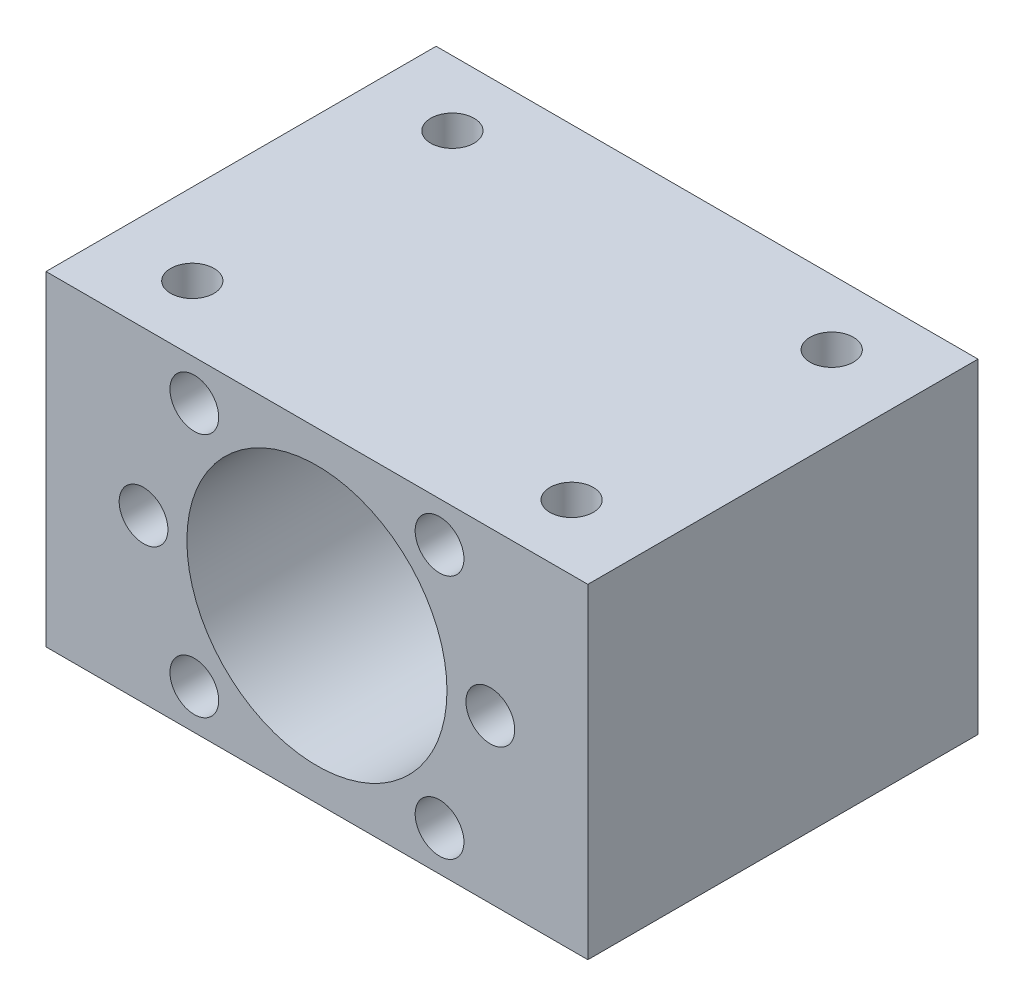
ISO-10303-21;
HEADER;
FILE_DESCRIPTION(('STEP AP214'),'2;1');
FILE_NAME('part.step','',(''),(''),'','','');
FILE_SCHEMA(('AUTOMOTIVE_DESIGN { 1 0 10303 214 1 1 1 1 }'));
ENDSEC;
DATA;
#1=APPLICATION_CONTEXT('core data for automotive mechanical design processes');
#2=APPLICATION_PROTOCOL_DEFINITION('international standard','automotive_design',2000,#1);
#3=PRODUCT_CONTEXT('',#1,'mechanical');
#4=PRODUCT('Part','Part','',(#3));
#5=PRODUCT_RELATED_PRODUCT_CATEGORY('part','',(#4));
#6=PRODUCT_DEFINITION_FORMATION('','',#4);
#7=PRODUCT_DEFINITION_CONTEXT('part definition',#1,'design');
#8=PRODUCT_DEFINITION('design','',#6,#7);
#9=PRODUCT_DEFINITION_SHAPE('','',#8);
#10=(LENGTH_UNIT() NAMED_UNIT(*) SI_UNIT(.MILLI.,.METRE.));
#11=(NAMED_UNIT(*) PLANE_ANGLE_UNIT() SI_UNIT($,.RADIAN.));
#12=(NAMED_UNIT(*) SI_UNIT($,.STERADIAN.) SOLID_ANGLE_UNIT());
#13=UNCERTAINTY_MEASURE_WITH_UNIT(LENGTH_MEASURE(1.E-05),#10,'distance_accuracy_value','');
#14=(GEOMETRIC_REPRESENTATION_CONTEXT(3) GLOBAL_UNCERTAINTY_ASSIGNED_CONTEXT((#13)) GLOBAL_UNIT_ASSIGNED_CONTEXT((#10,
#11,#12)) REPRESENTATION_CONTEXT('',''));
#15=CARTESIAN_POINT('',(0.,0.,0.));
#16=DIRECTION('',(0.,0.,1.));
#17=DIRECTION('',(1.,0.,0.));
#18=AXIS2_PLACEMENT_3D('',#15,#16,#17);
#19=CARTESIAN_POINT('',(0.,0.,36.));
#20=DIRECTION('',(0.,0.,1.));
#21=DIRECTION('',(1.,0.,0.));
#22=AXIS2_PLACEMENT_3D('',#19,#20,#21);
#23=PLANE('',#22);
#24=CARTESIAN_POINT('',(11.3137084989848,11.3137084989847,36.));
#25=DIRECTION('',(0.,0.,1.));
#26=DIRECTION('',(1.,0.,0.));
#27=AXIS2_PLACEMENT_3D('',#24,#25,#26);
#28=CIRCLE('',#27,2.24999999999997);
#29=CARTESIAN_POINT('',(13.5637084989847,11.3137084989847,36.));
#30=VERTEX_POINT('',#29);
#31=EDGE_CURVE('E147',#30,#30,#28,.T.);
#32=ORIENTED_EDGE('',*,*,#31,.F.);
#33=EDGE_LOOP('',(#32));
#34=FACE_BOUND('',#33,.T.);
#35=CARTESIAN_POINT('',(11.3137084989848,-11.3137084989847,36.));
#36=DIRECTION('',(0.,0.,1.));
#37=DIRECTION('',(1.,0.,0.));
#38=AXIS2_PLACEMENT_3D('',#35,#36,#37);
#39=CIRCLE('',#38,2.24999999999997);
#40=CARTESIAN_POINT('',(13.5637084989847,-11.3137084989847,36.));
#41=VERTEX_POINT('',#40);
#42=EDGE_CURVE('E135',#41,#41,#39,.T.);
#43=ORIENTED_EDGE('',*,*,#42,.F.);
#44=EDGE_LOOP('',(#43));
#45=FACE_BOUND('',#44,.T.);
#46=CARTESIAN_POINT('',(-16.,0.,36.));
#47=DIRECTION('',(0.,0.,1.));
#48=DIRECTION('',(1.,0.,0.));
#49=AXIS2_PLACEMENT_3D('',#46,#47,#48);
#50=CIRCLE('',#49,2.24999999999997);
#51=CARTESIAN_POINT('',(-13.75,0.,36.));
#52=VERTEX_POINT('',#51);
#53=EDGE_CURVE('E123',#52,#52,#50,.T.);
#54=ORIENTED_EDGE('',*,*,#53,.F.);
#55=EDGE_LOOP('',(#54));
#56=FACE_BOUND('',#55,.T.);
#57=DIRECTION('',(0.,1.,0.));
#58=VECTOR('',#57,1.);
#59=CARTESIAN_POINT('',(25.,-15.,36.));
#60=LINE('',#59,#58);
#61=CARTESIAN_POINT('',(25.,-15.,36.));
#62=VERTEX_POINT('',#61);
#63=CARTESIAN_POINT('',(25.,15.,36.));
#64=VERTEX_POINT('',#63);
#65=EDGE_CURVE('E93',#62,#64,#60,.T.);
#66=ORIENTED_EDGE('',*,*,#65,.T.);
#67=DIRECTION('',(-1.,0.,0.));
#68=VECTOR('',#67,1.);
#69=CARTESIAN_POINT('',(25.,15.,36.));
#70=LINE('',#69,#68);
#71=CARTESIAN_POINT('',(-25.,15.,36.));
#72=VERTEX_POINT('',#71);
#73=EDGE_CURVE('E88',#64,#72,#70,.T.);
#74=ORIENTED_EDGE('',*,*,#73,.T.);
#75=DIRECTION('',(0.,-1.,0.));
#76=VECTOR('',#75,1.);
#77=CARTESIAN_POINT('',(-25.,15.,36.));
#78=LINE('',#77,#76);
#79=CARTESIAN_POINT('',(-25.,-15.,36.));
#80=VERTEX_POINT('',#79);
#81=EDGE_CURVE('E91',#72,#80,#78,.T.);
#82=ORIENTED_EDGE('',*,*,#81,.T.);
#83=DIRECTION('',(1.,0.,0.));
#84=VECTOR('',#83,1.);
#85=CARTESIAN_POINT('',(-25.,-15.,36.));
#86=LINE('',#85,#84);
#87=EDGE_CURVE('E58',#80,#62,#86,.T.);
#88=ORIENTED_EDGE('',*,*,#87,.T.);
#89=EDGE_LOOP('',(#66,#74,#82,#88));
#90=FACE_BOUND('',#89,.T.);
#91=CARTESIAN_POINT('',(-11.3137084989847,11.3137084989847,36.));
#92=DIRECTION('',(0.,0.,1.));
#93=DIRECTION('',(1.,0.,0.));
#94=AXIS2_PLACEMENT_3D('',#91,#92,#93);
#95=CIRCLE('',#94,2.24999999999997);
#96=CARTESIAN_POINT('',(-9.06370849898478,11.3137084989847,36.));
#97=VERTEX_POINT('',#96);
#98=EDGE_CURVE('E108',#97,#97,#95,.T.);
#99=ORIENTED_EDGE('',*,*,#98,.F.);
#100=EDGE_LOOP('',(#99));
#101=FACE_BOUND('',#100,.T.);
#102=CARTESIAN_POINT('',(-11.3137084989848,-11.3137084989847,36.));
#103=DIRECTION('',(0.,0.,1.));
#104=DIRECTION('',(1.,0.,0.));
#105=AXIS2_PLACEMENT_3D('',#102,#103,#104);
#106=CIRCLE('',#105,2.24999999999997);
#107=CARTESIAN_POINT('',(-9.06370849898479,-11.3137084989847,36.));
#108=VERTEX_POINT('',#107);
#109=EDGE_CURVE('E129',#108,#108,#106,.T.);
#110=ORIENTED_EDGE('',*,*,#109,.F.);
#111=EDGE_LOOP('',(#110));
#112=FACE_BOUND('',#111,.T.);
#113=CARTESIAN_POINT('',(16.,0.,36.));
#114=DIRECTION('',(0.,0.,1.));
#115=DIRECTION('',(1.,0.,0.));
#116=AXIS2_PLACEMENT_3D('',#113,#114,#115);
#117=CIRCLE('',#116,2.24999999999997);
#118=CARTESIAN_POINT('',(18.25,0.,36.));
#119=VERTEX_POINT('',#118);
#120=EDGE_CURVE('E141',#119,#119,#117,.T.);
#121=ORIENTED_EDGE('',*,*,#120,.F.);
#122=EDGE_LOOP('',(#121));
#123=FACE_BOUND('',#122,.T.);
#124=CARTESIAN_POINT('',(0.,0.,36.));
#125=DIRECTION('',(0.,0.,1.));
#126=DIRECTION('',(1.,0.,0.));
#127=AXIS2_PLACEMENT_3D('',#124,#125,#126);
#128=CIRCLE('',#127,12.);
#129=CARTESIAN_POINT('',(12.,0.,36.));
#130=VERTEX_POINT('',#129);
#131=EDGE_CURVE('E153',#130,#130,#128,.T.);
#132=ORIENTED_EDGE('',*,*,#131,.F.);
#133=EDGE_LOOP('',(#132));
#134=FACE_BOUND('',#133,.T.);
#135=ADVANCED_FACE('F41',(#34,#45,#56,#90,#101,#112,#123,#134),#23,.T.);
#136=CARTESIAN_POINT('',(0.,0.,0.));
#137=DIRECTION('',(0.,0.,1.));
#138=DIRECTION('',(1.,0.,0.));
#139=AXIS2_PLACEMENT_3D('',#136,#137,#138);
#140=PLANE('',#139);
#141=DIRECTION('',(0.,1.,0.));
#142=VECTOR('',#141,1.);
#143=CARTESIAN_POINT('',(25.,-15.,0.));
#144=LINE('',#143,#142);
#145=CARTESIAN_POINT('',(25.,-15.,0.));
#146=VERTEX_POINT('',#145);
#147=CARTESIAN_POINT('',(25.,15.,0.));
#148=VERTEX_POINT('',#147);
#149=EDGE_CURVE('E105',#146,#148,#144,.T.);
#150=ORIENTED_EDGE('',*,*,#149,.F.);
#151=DIRECTION('',(1.,0.,0.));
#152=VECTOR('',#151,1.);
#153=CARTESIAN_POINT('',(-25.,-15.,0.));
#154=LINE('',#153,#152);
#155=CARTESIAN_POINT('',(-25.,-15.,0.));
#156=VERTEX_POINT('',#155);
#157=EDGE_CURVE('E81',#156,#146,#154,.T.);
#158=ORIENTED_EDGE('',*,*,#157,.F.);
#159=DIRECTION('',(0.,-1.,0.));
#160=VECTOR('',#159,1.);
#161=CARTESIAN_POINT('',(-25.,15.,0.));
#162=LINE('',#161,#160);
#163=CARTESIAN_POINT('',(-25.,15.,0.));
#164=VERTEX_POINT('',#163);
#165=EDGE_CURVE('E75',#164,#156,#162,.T.);
#166=ORIENTED_EDGE('',*,*,#165,.F.);
#167=DIRECTION('',(-1.,0.,0.));
#168=VECTOR('',#167,1.);
#169=CARTESIAN_POINT('',(25.,15.,0.));
#170=LINE('',#169,#168);
#171=EDGE_CURVE('E97',#148,#164,#170,.T.);
#172=ORIENTED_EDGE('',*,*,#171,.F.);
#173=EDGE_LOOP('',(#150,#158,#166,#172));
#174=FACE_BOUND('',#173,.T.);
#175=CARTESIAN_POINT('',(-11.3137084989847,11.3137084989847,0.));
#176=DIRECTION('',(0.,0.,1.));
#177=DIRECTION('',(1.,0.,0.));
#178=AXIS2_PLACEMENT_3D('',#175,#176,#177);
#179=CIRCLE('',#178,2.24999999999997);
#180=CARTESIAN_POINT('',(-9.06370849898478,11.3137084989847,0.));
#181=VERTEX_POINT('',#180);
#182=EDGE_CURVE('E120',#181,#181,#179,.T.);
#183=ORIENTED_EDGE('',*,*,#182,.T.);
#184=EDGE_LOOP('',(#183));
#185=FACE_BOUND('',#184,.T.);
#186=CARTESIAN_POINT('',(-16.,0.,0.));
#187=DIRECTION('',(0.,0.,1.));
#188=DIRECTION('',(1.,0.,0.));
#189=AXIS2_PLACEMENT_3D('',#186,#187,#188);
#190=CIRCLE('',#189,2.24999999999997);
#191=CARTESIAN_POINT('',(-13.75,0.,0.));
#192=VERTEX_POINT('',#191);
#193=EDGE_CURVE('E126',#192,#192,#190,.T.);
#194=ORIENTED_EDGE('',*,*,#193,.T.);
#195=EDGE_LOOP('',(#194));
#196=FACE_BOUND('',#195,.T.);
#197=CARTESIAN_POINT('',(-11.3137084989848,-11.3137084989847,0.));
#198=DIRECTION('',(0.,0.,1.));
#199=DIRECTION('',(1.,0.,0.));
#200=AXIS2_PLACEMENT_3D('',#197,#198,#199);
#201=CIRCLE('',#200,2.24999999999997);
#202=CARTESIAN_POINT('',(-9.06370849898479,-11.3137084989847,0.));
#203=VERTEX_POINT('',#202);
#204=EDGE_CURVE('E132',#203,#203,#201,.T.);
#205=ORIENTED_EDGE('',*,*,#204,.T.);
#206=EDGE_LOOP('',(#205));
#207=FACE_BOUND('',#206,.T.);
#208=CARTESIAN_POINT('',(11.3137084989848,-11.3137084989847,0.));
#209=DIRECTION('',(0.,0.,1.));
#210=DIRECTION('',(1.,0.,0.));
#211=AXIS2_PLACEMENT_3D('',#208,#209,#210);
#212=CIRCLE('',#211,2.24999999999997);
#213=CARTESIAN_POINT('',(13.5637084989847,-11.3137084989847,0.));
#214=VERTEX_POINT('',#213);
#215=EDGE_CURVE('E138',#214,#214,#212,.T.);
#216=ORIENTED_EDGE('',*,*,#215,.T.);
#217=EDGE_LOOP('',(#216));
#218=FACE_BOUND('',#217,.T.);
#219=CARTESIAN_POINT('',(16.,0.,0.));
#220=DIRECTION('',(0.,0.,1.));
#221=DIRECTION('',(1.,0.,0.));
#222=AXIS2_PLACEMENT_3D('',#219,#220,#221);
#223=CIRCLE('',#222,2.24999999999997);
#224=CARTESIAN_POINT('',(18.25,0.,0.));
#225=VERTEX_POINT('',#224);
#226=EDGE_CURVE('E144',#225,#225,#223,.T.);
#227=ORIENTED_EDGE('',*,*,#226,.T.);
#228=EDGE_LOOP('',(#227));
#229=FACE_BOUND('',#228,.T.);
#230=CARTESIAN_POINT('',(11.3137084989848,11.3137084989847,0.));
#231=DIRECTION('',(0.,0.,1.));
#232=DIRECTION('',(1.,0.,0.));
#233=AXIS2_PLACEMENT_3D('',#230,#231,#232);
#234=CIRCLE('',#233,2.24999999999997);
#235=CARTESIAN_POINT('',(13.5637084989847,11.3137084989847,0.));
#236=VERTEX_POINT('',#235);
#237=EDGE_CURVE('E150',#236,#236,#234,.T.);
#238=ORIENTED_EDGE('',*,*,#237,.T.);
#239=EDGE_LOOP('',(#238));
#240=FACE_BOUND('',#239,.T.);
#241=CARTESIAN_POINT('',(0.,0.,0.));
#242=DIRECTION('',(0.,0.,1.));
#243=DIRECTION('',(1.,0.,0.));
#244=AXIS2_PLACEMENT_3D('',#241,#242,#243);
#245=CIRCLE('',#244,12.);
#246=CARTESIAN_POINT('',(12.,0.,0.));
#247=VERTEX_POINT('',#246);
#248=EDGE_CURVE('E156',#247,#247,#245,.T.);
#249=ORIENTED_EDGE('',*,*,#248,.T.);
#250=EDGE_LOOP('',(#249));
#251=FACE_BOUND('',#250,.T.);
#252=ADVANCED_FACE('F116',(#174,#185,#196,#207,#218,#229,#240,#251),#140,.F.);
#253=CARTESIAN_POINT('',(25.,-15.,36.));
#254=DIRECTION('',(-1.,0.,0.));
#255=DIRECTION('',(0.,-1.,0.));
#256=AXIS2_PLACEMENT_3D('',#253,#254,#255);
#257=PLANE('',#256);
#258=ORIENTED_EDGE('',*,*,#149,.T.);
#259=DIRECTION('',(0.,0.,-1.));
#260=VECTOR('',#259,1.);
#261=CARTESIAN_POINT('',(25.,15.,36.));
#262=LINE('',#261,#260);
#263=EDGE_CURVE('E11',#64,#148,#262,.T.);
#264=ORIENTED_EDGE('',*,*,#263,.F.);
#265=ORIENTED_EDGE('',*,*,#65,.F.);
#266=DIRECTION('',(0.,0.,-1.));
#267=VECTOR('',#266,1.);
#268=CARTESIAN_POINT('',(25.,-15.,36.));
#269=LINE('',#268,#267);
#270=EDGE_CURVE('E101',#62,#146,#269,.T.);
#271=ORIENTED_EDGE('',*,*,#270,.T.);
#272=EDGE_LOOP('',(#258,#264,#265,#271));
#273=FACE_BOUND('',#272,.T.);
#274=ADVANCED_FACE('F43',(#273),#257,.F.);
#275=CARTESIAN_POINT('',(25.,15.,36.));
#276=DIRECTION('',(0.,-1.,0.));
#277=DIRECTION('',(0.,0.,-1.));
#278=AXIS2_PLACEMENT_3D('',#275,#276,#277);
#279=PLANE('',#278);
#280=CARTESIAN_POINT('',(-17.5,15.,30.));
#281=DIRECTION('',(0.,1.,0.));
#282=DIRECTION('',(0.,0.,-1.));
#283=AXIS2_PLACEMENT_3D('',#280,#281,#282);
#284=CIRCLE('',#283,2.);
#285=CARTESIAN_POINT('',(-17.5,15.,28.));
#286=VERTEX_POINT('',#285);
#287=EDGE_CURVE('E171',#286,#286,#284,.T.);
#288=ORIENTED_EDGE('',*,*,#287,.F.);
#289=EDGE_LOOP('',(#288));
#290=FACE_BOUND('',#289,.T.);
#291=CARTESIAN_POINT('',(17.5,15.,6.));
#292=DIRECTION('',(0.,1.,0.));
#293=DIRECTION('',(0.,0.,-1.));
#294=AXIS2_PLACEMENT_3D('',#291,#292,#293);
#295=CIRCLE('',#294,2.);
#296=CARTESIAN_POINT('',(17.5,15.,3.99999999999999));
#297=VERTEX_POINT('',#296);
#298=EDGE_CURVE('E177',#297,#297,#295,.T.);
#299=ORIENTED_EDGE('',*,*,#298,.F.);
#300=EDGE_LOOP('',(#299));
#301=FACE_BOUND('',#300,.T.);
#302=CARTESIAN_POINT('',(-17.5,15.,6.));
#303=DIRECTION('',(0.,1.,0.));
#304=DIRECTION('',(0.,0.,1.));
#305=AXIS2_PLACEMENT_3D('',#302,#303,#304);
#306=CIRCLE('',#305,2.);
#307=CARTESIAN_POINT('',(-17.5,15.,8.00000000000001));
#308=VERTEX_POINT('',#307);
#309=EDGE_CURVE('E165',#308,#308,#306,.T.);
#310=ORIENTED_EDGE('',*,*,#309,.F.);
#311=EDGE_LOOP('',(#310));
#312=FACE_BOUND('',#311,.T.);
#313=CARTESIAN_POINT('',(17.5,15.,30.));
#314=DIRECTION('',(0.,1.,0.));
#315=DIRECTION('',(0.,0.,1.));
#316=AXIS2_PLACEMENT_3D('',#313,#314,#315);
#317=CIRCLE('',#316,2.);
#318=CARTESIAN_POINT('',(17.5,15.,32.));
#319=VERTEX_POINT('',#318);
#320=EDGE_CURVE('E162',#319,#319,#317,.T.);
#321=ORIENTED_EDGE('',*,*,#320,.F.);
#322=EDGE_LOOP('',(#321));
#323=FACE_BOUND('',#322,.T.);
#324=ORIENTED_EDGE('',*,*,#171,.T.);
#325=DIRECTION('',(0.,0.,-1.));
#326=VECTOR('',#325,1.);
#327=CARTESIAN_POINT('',(-25.,15.,36.));
#328=LINE('',#327,#326);
#329=EDGE_CURVE('E50',#72,#164,#328,.T.);
#330=ORIENTED_EDGE('',*,*,#329,.F.);
#331=ORIENTED_EDGE('',*,*,#73,.F.);
#332=ORIENTED_EDGE('',*,*,#263,.T.);
#333=EDGE_LOOP('',(#324,#330,#331,#332));
#334=FACE_BOUND('',#333,.T.);
#335=ADVANCED_FACE('F96',(#290,#301,#312,#323,#334),#279,.F.);
#336=CARTESIAN_POINT('',(-25.,15.,36.));
#337=DIRECTION('',(1.,0.,0.));
#338=DIRECTION('',(0.,1.,0.));
#339=AXIS2_PLACEMENT_3D('',#336,#337,#338);
#340=PLANE('',#339);
#341=ORIENTED_EDGE('',*,*,#165,.T.);
#342=DIRECTION('',(0.,0.,-1.));
#343=VECTOR('',#342,1.);
#344=CARTESIAN_POINT('',(-25.,-15.,36.));
#345=LINE('',#344,#343);
#346=EDGE_CURVE('E98',#80,#156,#345,.T.);
#347=ORIENTED_EDGE('',*,*,#346,.F.);
#348=ORIENTED_EDGE('',*,*,#81,.F.);
#349=ORIENTED_EDGE('',*,*,#329,.T.);
#350=EDGE_LOOP('',(#341,#347,#348,#349));
#351=FACE_BOUND('',#350,.T.);
#352=ADVANCED_FACE('F99',(#351),#340,.F.);
#353=CARTESIAN_POINT('',(-25.,-15.,36.));
#354=DIRECTION('',(0.,1.,0.));
#355=DIRECTION('',(0.,0.,1.));
#356=AXIS2_PLACEMENT_3D('',#353,#354,#355);
#357=PLANE('',#356);
#358=ORIENTED_EDGE('',*,*,#157,.T.);
#359=ORIENTED_EDGE('',*,*,#270,.F.);
#360=ORIENTED_EDGE('',*,*,#87,.F.);
#361=ORIENTED_EDGE('',*,*,#346,.T.);
#362=EDGE_LOOP('',(#358,#359,#360,#361));
#363=FACE_BOUND('',#362,.T.);
#364=ADVANCED_FACE('F113',(#363),#357,.F.);
#365=CARTESIAN_POINT('',(-11.3137084989847,11.3137084989847,36.));
#366=DIRECTION('',(0.,0.,-1.));
#367=DIRECTION('',(-1.,0.,0.));
#368=AXIS2_PLACEMENT_3D('',#365,#366,#367);
#369=CYLINDRICAL_SURFACE('',#368,2.24999999999997);
#370=ORIENTED_EDGE('',*,*,#98,.T.);
#371=EDGE_LOOP('',(#370));
#372=FACE_BOUND('',#371,.T.);
#373=ORIENTED_EDGE('',*,*,#182,.F.);
#374=EDGE_LOOP('',(#373));
#375=FACE_BOUND('',#374,.T.);
#376=ADVANCED_FACE('F219',(#372,#375),#369,.F.);
#377=CARTESIAN_POINT('',(-16.,0.,36.));
#378=DIRECTION('',(0.,0.,-1.));
#379=DIRECTION('',(-1.,0.,0.));
#380=AXIS2_PLACEMENT_3D('',#377,#378,#379);
#381=CYLINDRICAL_SURFACE('',#380,2.24999999999997);
#382=ORIENTED_EDGE('',*,*,#53,.T.);
#383=EDGE_LOOP('',(#382));
#384=FACE_BOUND('',#383,.T.);
#385=ORIENTED_EDGE('',*,*,#193,.F.);
#386=EDGE_LOOP('',(#385));
#387=FACE_BOUND('',#386,.T.);
#388=ADVANCED_FACE('F243',(#384,#387),#381,.F.);
#389=CARTESIAN_POINT('',(-11.3137084989848,-11.3137084989847,36.));
#390=DIRECTION('',(0.,0.,-1.));
#391=DIRECTION('',(-1.,0.,0.));
#392=AXIS2_PLACEMENT_3D('',#389,#390,#391);
#393=CYLINDRICAL_SURFACE('',#392,2.24999999999997);
#394=ORIENTED_EDGE('',*,*,#109,.T.);
#395=EDGE_LOOP('',(#394));
#396=FACE_BOUND('',#395,.T.);
#397=ORIENTED_EDGE('',*,*,#204,.F.);
#398=EDGE_LOOP('',(#397));
#399=FACE_BOUND('',#398,.T.);
#400=ADVANCED_FACE('F251',(#396,#399),#393,.F.);
#401=CARTESIAN_POINT('',(11.3137084989848,-11.3137084989847,36.));
#402=DIRECTION('',(0.,0.,-1.));
#403=DIRECTION('',(-1.,0.,0.));
#404=AXIS2_PLACEMENT_3D('',#401,#402,#403);
#405=CYLINDRICAL_SURFACE('',#404,2.24999999999997);
#406=ORIENTED_EDGE('',*,*,#42,.T.);
#407=EDGE_LOOP('',(#406));
#408=FACE_BOUND('',#407,.T.);
#409=ORIENTED_EDGE('',*,*,#215,.F.);
#410=EDGE_LOOP('',(#409));
#411=FACE_BOUND('',#410,.T.);
#412=ADVANCED_FACE('F259',(#408,#411),#405,.F.);
#413=CARTESIAN_POINT('',(16.,0.,36.));
#414=DIRECTION('',(0.,0.,-1.));
#415=DIRECTION('',(-1.,0.,0.));
#416=AXIS2_PLACEMENT_3D('',#413,#414,#415);
#417=CYLINDRICAL_SURFACE('',#416,2.24999999999997);
#418=ORIENTED_EDGE('',*,*,#120,.T.);
#419=EDGE_LOOP('',(#418));
#420=FACE_BOUND('',#419,.T.);
#421=ORIENTED_EDGE('',*,*,#226,.F.);
#422=EDGE_LOOP('',(#421));
#423=FACE_BOUND('',#422,.T.);
#424=ADVANCED_FACE('F268',(#420,#423),#417,.F.);
#425=CARTESIAN_POINT('',(11.3137084989848,11.3137084989847,36.));
#426=DIRECTION('',(0.,0.,-1.));
#427=DIRECTION('',(-1.,0.,0.));
#428=AXIS2_PLACEMENT_3D('',#425,#426,#427);
#429=CYLINDRICAL_SURFACE('',#428,2.24999999999997);
#430=ORIENTED_EDGE('',*,*,#31,.T.);
#431=EDGE_LOOP('',(#430));
#432=FACE_BOUND('',#431,.T.);
#433=ORIENTED_EDGE('',*,*,#237,.F.);
#434=EDGE_LOOP('',(#433));
#435=FACE_BOUND('',#434,.T.);
#436=ADVANCED_FACE('F205',(#432,#435),#429,.F.);
#437=CARTESIAN_POINT('',(0.,0.,36.));
#438=DIRECTION('',(0.,0.,-1.));
#439=DIRECTION('',(-1.,0.,0.));
#440=AXIS2_PLACEMENT_3D('',#437,#438,#439);
#441=CYLINDRICAL_SURFACE('',#440,12.);
#442=ORIENTED_EDGE('',*,*,#131,.T.);
#443=EDGE_LOOP('',(#442));
#444=FACE_BOUND('',#443,.T.);
#445=ORIENTED_EDGE('',*,*,#248,.F.);
#446=EDGE_LOOP('',(#445));
#447=FACE_BOUND('',#446,.T.);
#448=ADVANCED_FACE('F196',(#444,#447),#441,.F.);
#449=CARTESIAN_POINT('',(17.5,4.80000000000001,30.));
#450=DIRECTION('',(0.,1.,0.));
#451=DIRECTION('',(0.,0.,1.));
#452=AXIS2_PLACEMENT_3D('',#449,#450,#451);
#453=CYLINDRICAL_SURFACE('',#452,2.);
#454=CARTESIAN_POINT('',(17.5,4.80000000000001,30.));
#455=DIRECTION('',(0.,1.,0.));
#456=DIRECTION('',(0.,0.,1.));
#457=AXIS2_PLACEMENT_3D('',#454,#455,#456);
#458=CIRCLE('',#457,2.);
#459=CARTESIAN_POINT('',(17.5,4.80000000000001,32.));
#460=VERTEX_POINT('',#459);
#461=EDGE_CURVE('E159',#460,#460,#458,.T.);
#462=ORIENTED_EDGE('',*,*,#461,.F.);
#463=EDGE_LOOP('',(#462));
#464=FACE_BOUND('',#463,.T.);
#465=ORIENTED_EDGE('',*,*,#320,.T.);
#466=EDGE_LOOP('',(#465));
#467=FACE_BOUND('',#466,.T.);
#468=ADVANCED_FACE('F193',(#464,#467),#453,.F.);
#469=CARTESIAN_POINT('',(17.5,4.80000000000001,30.));
#470=DIRECTION('',(0.,1.,0.));
#471=DIRECTION('',(0.,0.,1.));
#472=AXIS2_PLACEMENT_3D('',#469,#470,#471);
#473=PLANE('',#472);
#474=ORIENTED_EDGE('',*,*,#461,.T.);
#475=EDGE_LOOP('',(#474));
#476=FACE_BOUND('',#475,.T.);
#477=ADVANCED_FACE('F195',(#476),#473,.T.);
#478=CARTESIAN_POINT('',(-17.5,4.80000000000001,6.));
#479=DIRECTION('',(0.,1.,0.));
#480=DIRECTION('',(0.,0.,1.));
#481=AXIS2_PLACEMENT_3D('',#478,#479,#480);
#482=CYLINDRICAL_SURFACE('',#481,2.);
#483=CARTESIAN_POINT('',(-17.5,4.80000000000001,6.));
#484=DIRECTION('',(0.,1.,0.));
#485=DIRECTION('',(0.,0.,1.));
#486=AXIS2_PLACEMENT_3D('',#483,#484,#485);
#487=CIRCLE('',#486,2.);
#488=CARTESIAN_POINT('',(-17.5,4.80000000000001,8.00000000000001));
#489=VERTEX_POINT('',#488);
#490=EDGE_CURVE('E180',#489,#489,#487,.T.);
#491=ORIENTED_EDGE('',*,*,#490,.F.);
#492=EDGE_LOOP('',(#491));
#493=FACE_BOUND('',#492,.T.);
#494=ORIENTED_EDGE('',*,*,#309,.T.);
#495=EDGE_LOOP('',(#494));
#496=FACE_BOUND('',#495,.T.);
#497=ADVANCED_FACE('F186',(#493,#496),#482,.F.);
#498=CARTESIAN_POINT('',(-17.5,4.80000000000001,6.));
#499=DIRECTION('',(0.,1.,0.));
#500=DIRECTION('',(0.,0.,1.));
#501=AXIS2_PLACEMENT_3D('',#498,#499,#500);
#502=PLANE('',#501);
#503=ORIENTED_EDGE('',*,*,#490,.T.);
#504=EDGE_LOOP('',(#503));
#505=FACE_BOUND('',#504,.T.);
#506=ADVANCED_FACE('F336',(#505),#502,.T.);
#507=CARTESIAN_POINT('',(17.5,4.80000000000001,6.));
#508=DIRECTION('',(0.,1.,0.));
#509=DIRECTION('',(0.,0.,1.));
#510=AXIS2_PLACEMENT_3D('',#507,#508,#509);
#511=CYLINDRICAL_SURFACE('',#510,2.);
#512=CARTESIAN_POINT('',(17.5,4.80000000000001,6.));
#513=DIRECTION('',(0.,1.,0.));
#514=DIRECTION('',(0.,0.,-1.));
#515=AXIS2_PLACEMENT_3D('',#512,#513,#514);
#516=CIRCLE('',#515,2.);
#517=CARTESIAN_POINT('',(17.5,4.80000000000001,3.99999999999999));
#518=VERTEX_POINT('',#517);
#519=EDGE_CURVE('E174',#518,#518,#516,.T.);
#520=ORIENTED_EDGE('',*,*,#519,.F.);
#521=EDGE_LOOP('',(#520));
#522=FACE_BOUND('',#521,.T.);
#523=ORIENTED_EDGE('',*,*,#298,.T.);
#524=EDGE_LOOP('',(#523));
#525=FACE_BOUND('',#524,.T.);
#526=ADVANCED_FACE('F345',(#522,#525),#511,.F.);
#527=CARTESIAN_POINT('',(17.5,4.80000000000001,6.));
#528=DIRECTION('',(0.,-1.,0.));
#529=DIRECTION('',(0.,0.,-1.));
#530=AXIS2_PLACEMENT_3D('',#527,#528,#529);
#531=PLANE('',#530);
#532=ORIENTED_EDGE('',*,*,#519,.T.);
#533=EDGE_LOOP('',(#532));
#534=FACE_BOUND('',#533,.T.);
#535=ADVANCED_FACE('F354',(#534),#531,.F.);
#536=CARTESIAN_POINT('',(-17.5,4.80000000000001,30.));
#537=DIRECTION('',(0.,1.,0.));
#538=DIRECTION('',(0.,0.,1.));
#539=AXIS2_PLACEMENT_3D('',#536,#537,#538);
#540=CYLINDRICAL_SURFACE('',#539,2.);
#541=CARTESIAN_POINT('',(-17.5,4.80000000000001,30.));
#542=DIRECTION('',(0.,1.,0.));
#543=DIRECTION('',(0.,0.,-1.));
#544=AXIS2_PLACEMENT_3D('',#541,#542,#543);
#545=CIRCLE('',#544,2.);
#546=CARTESIAN_POINT('',(-17.5,4.80000000000001,28.));
#547=VERTEX_POINT('',#546);
#548=EDGE_CURVE('E168',#547,#547,#545,.T.);
#549=ORIENTED_EDGE('',*,*,#548,.F.);
#550=EDGE_LOOP('',(#549));
#551=FACE_BOUND('',#550,.T.);
#552=ORIENTED_EDGE('',*,*,#287,.T.);
#553=EDGE_LOOP('',(#552));
#554=FACE_BOUND('',#553,.T.);
#555=ADVANCED_FACE('F363',(#551,#554),#540,.F.);
#556=CARTESIAN_POINT('',(-17.5,4.80000000000001,30.));
#557=DIRECTION('',(0.,-1.,0.));
#558=DIRECTION('',(0.,0.,-1.));
#559=AXIS2_PLACEMENT_3D('',#556,#557,#558);
#560=PLANE('',#559);
#561=ORIENTED_EDGE('',*,*,#548,.T.);
#562=EDGE_LOOP('',(#561));
#563=FACE_BOUND('',#562,.T.);
#564=ADVANCED_FACE('F372',(#563),#560,.F.);
#565=CLOSED_SHELL('',(#135,#252,#274,#335,#352,#364,#376,#388,#400,#412,#424,#436,#448,#468,
#477,#497,#506,#526,#535,#555,#564));
#566=MANIFOLD_SOLID_BREP('B2',#565);
#567=ADVANCED_BREP_SHAPE_REPRESENTATION('',(#18,#566),#14);
#568=SHAPE_DEFINITION_REPRESENTATION(#9,#567);
ENDSEC;
END-ISO-10303-21;
